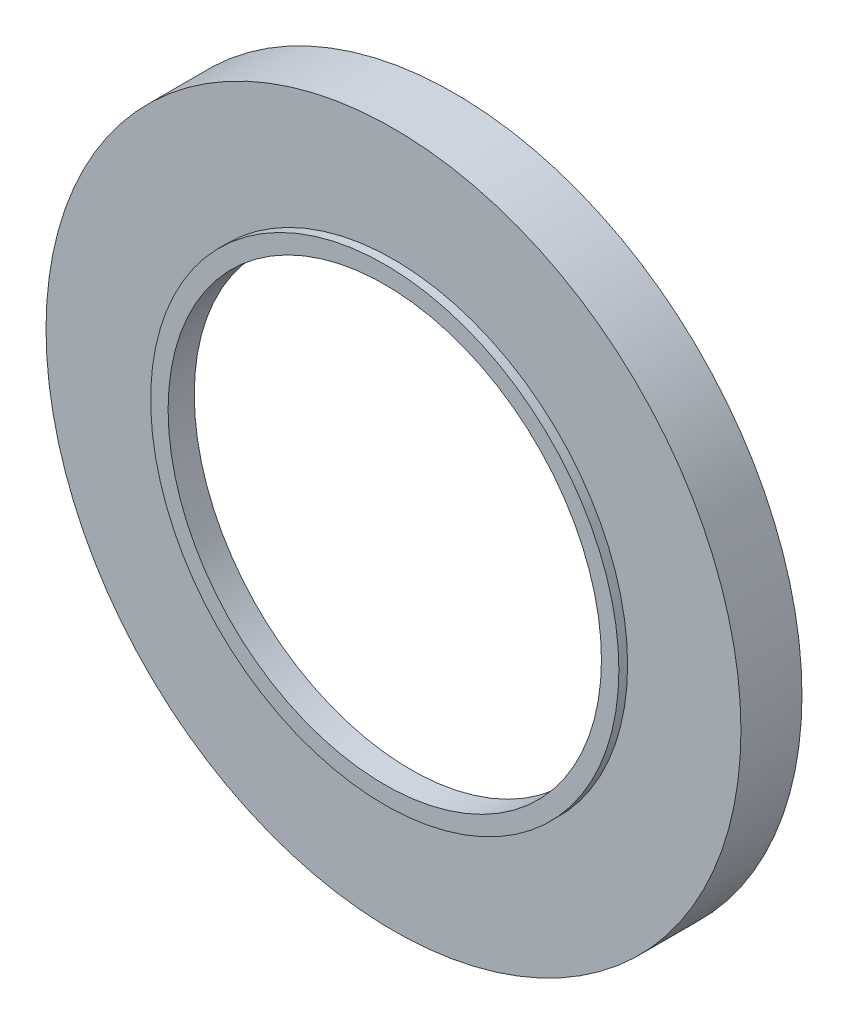
ISO-10303-21;
HEADER;
FILE_DESCRIPTION(('STEP AP214'),'2;1');
FILE_NAME('part.step','',(''),(''),'','','');
FILE_SCHEMA(('AUTOMOTIVE_DESIGN { 1 0 10303 214 1 1 1 1 }'));
ENDSEC;
DATA;
#1=APPLICATION_CONTEXT('core data for automotive mechanical design processes');
#2=APPLICATION_PROTOCOL_DEFINITION('international standard','automotive_design',2000,#1);
#3=PRODUCT_CONTEXT('',#1,'mechanical');
#4=PRODUCT('Part','Part','',(#3));
#5=PRODUCT_RELATED_PRODUCT_CATEGORY('part','',(#4));
#6=PRODUCT_DEFINITION_FORMATION('','',#4);
#7=PRODUCT_DEFINITION_CONTEXT('part definition',#1,'design');
#8=PRODUCT_DEFINITION('design','',#6,#7);
#9=PRODUCT_DEFINITION_SHAPE('','',#8);
#10=(LENGTH_UNIT() NAMED_UNIT(*) SI_UNIT(.MILLI.,.METRE.));
#11=(NAMED_UNIT(*) PLANE_ANGLE_UNIT() SI_UNIT($,.RADIAN.));
#12=(NAMED_UNIT(*) SI_UNIT($,.STERADIAN.) SOLID_ANGLE_UNIT());
#13=UNCERTAINTY_MEASURE_WITH_UNIT(LENGTH_MEASURE(1.E-05),#10,'distance_accuracy_value','');
#14=(GEOMETRIC_REPRESENTATION_CONTEXT(3) GLOBAL_UNCERTAINTY_ASSIGNED_CONTEXT((#13)) GLOBAL_UNIT_ASSIGNED_CONTEXT((#10,
#11,#12)) REPRESENTATION_CONTEXT('',''));
#15=CARTESIAN_POINT('',(0.,0.,0.));
#16=DIRECTION('',(0.,0.,1.));
#17=DIRECTION('',(1.,0.,0.));
#18=AXIS2_PLACEMENT_3D('',#15,#16,#17);
#19=CARTESIAN_POINT('',(0.,0.,7.));
#20=DIRECTION('',(0.,0.,1.));
#21=DIRECTION('',(1.,0.,0.));
#22=AXIS2_PLACEMENT_3D('',#19,#20,#21);
#23=PLANE('',#22);
#24=CARTESIAN_POINT('',(0.,0.,7.));
#25=DIRECTION('',(0.,0.,1.));
#26=DIRECTION('',(1.,0.,0.));
#27=AXIS2_PLACEMENT_3D('',#24,#25,#26);
#28=CIRCLE('',#27,39.8513353763524);
#29=CARTESIAN_POINT('',(39.8513353763524,0.,7.));
#30=VERTEX_POINT('',#29);
#31=EDGE_CURVE('E73',#30,#30,#28,.T.);
#32=ORIENTED_EDGE('',*,*,#31,.T.);
#33=EDGE_LOOP('',(#32));
#34=FACE_BOUND('',#33,.T.);
#35=CARTESIAN_POINT('',(0.,0.,7.));
#36=DIRECTION('',(0.,0.,1.));
#37=DIRECTION('',(1.,0.,0.));
#38=AXIS2_PLACEMENT_3D('',#35,#36,#37);
#39=CIRCLE('',#38,26.8513353763524);
#40=CARTESIAN_POINT('',(26.8513353763524,0.,7.));
#41=VERTEX_POINT('',#40);
#42=EDGE_CURVE('E82',#41,#41,#39,.T.);
#43=ORIENTED_EDGE('',*,*,#42,.F.);
#44=EDGE_LOOP('',(#43));
#45=FACE_BOUND('',#44,.T.);
#46=ADVANCED_FACE('F58',(#34,#45),#23,.T.);
#47=CARTESIAN_POINT('',(0.,0.,0.));
#48=DIRECTION('',(0.,0.,1.));
#49=DIRECTION('',(1.,0.,0.));
#50=AXIS2_PLACEMENT_3D('',#47,#48,#49);
#51=PLANE('',#50);
#52=CARTESIAN_POINT('',(0.,0.,0.));
#53=DIRECTION('',(0.,0.,1.));
#54=DIRECTION('',(1.,0.,0.));
#55=AXIS2_PLACEMENT_3D('',#52,#53,#54);
#56=CIRCLE('',#55,39.8513353763524);
#57=CARTESIAN_POINT('',(39.8513353763524,0.,0.));
#58=VERTEX_POINT('',#57);
#59=EDGE_CURVE('E11',#58,#58,#56,.T.);
#60=ORIENTED_EDGE('',*,*,#59,.F.);
#61=EDGE_LOOP('',(#60));
#62=FACE_BOUND('',#61,.T.);
#63=CARTESIAN_POINT('',(0.,0.,0.));
#64=DIRECTION('',(0.,0.,1.));
#65=DIRECTION('',(1.,0.,0.));
#66=AXIS2_PLACEMENT_3D('',#63,#64,#65);
#67=CIRCLE('',#66,37.8513353763524);
#68=CARTESIAN_POINT('',(37.8513353763524,0.,0.));
#69=VERTEX_POINT('',#68);
#70=EDGE_CURVE('E65',#69,#69,#67,.T.);
#71=ORIENTED_EDGE('',*,*,#70,.T.);
#72=EDGE_LOOP('',(#71));
#73=FACE_BOUND('',#72,.T.);
#74=ADVANCED_FACE('F108',(#62,#73),#51,.F.);
#75=CARTESIAN_POINT('',(0.,0.,5.));
#76=DIRECTION('',(0.,0.,-1.));
#77=DIRECTION('',(-1.,0.,0.));
#78=AXIS2_PLACEMENT_3D('',#75,#76,#77);
#79=CYLINDRICAL_SURFACE('',#78,39.8513353763524);
#80=ORIENTED_EDGE('',*,*,#59,.T.);
#81=EDGE_LOOP('',(#80));
#82=FACE_BOUND('',#81,.T.);
#83=ORIENTED_EDGE('',*,*,#31,.F.);
#84=EDGE_LOOP('',(#83));
#85=FACE_BOUND('',#84,.T.);
#86=ADVANCED_FACE('F60',(#82,#85),#79,.T.);
#87=CARTESIAN_POINT('',(0.,0.,5.));
#88=DIRECTION('',(0.,0.,-1.));
#89=DIRECTION('',(-1.,0.,0.));
#90=AXIS2_PLACEMENT_3D('',#87,#88,#89);
#91=CYLINDRICAL_SURFACE('',#90,37.8513353763524);
#92=CARTESIAN_POINT('',(0.,0.,5.));
#93=DIRECTION('',(0.,0.,1.));
#94=DIRECTION('',(1.,0.,0.));
#95=AXIS2_PLACEMENT_3D('',#92,#93,#94);
#96=CIRCLE('',#95,37.8513353763524);
#97=CARTESIAN_POINT('',(37.8513353763524,0.,5.));
#98=VERTEX_POINT('',#97);
#99=EDGE_CURVE('E69',#98,#98,#96,.T.);
#100=ORIENTED_EDGE('',*,*,#99,.T.);
#101=EDGE_LOOP('',(#100));
#102=FACE_BOUND('',#101,.T.);
#103=ORIENTED_EDGE('',*,*,#70,.F.);
#104=EDGE_LOOP('',(#103));
#105=FACE_BOUND('',#104,.T.);
#106=ADVANCED_FACE('F119',(#102,#105),#91,.F.);
#107=CARTESIAN_POINT('',(0.,0.,5.));
#108=DIRECTION('',(0.,0.,1.));
#109=DIRECTION('',(1.,0.,0.));
#110=AXIS2_PLACEMENT_3D('',#107,#108,#109);
#111=PLANE('',#110);
#112=CARTESIAN_POINT('',(0.,0.,5.));
#113=DIRECTION('',(0.,0.,1.));
#114=DIRECTION('',(1.,0.,0.));
#115=AXIS2_PLACEMENT_3D('',#112,#113,#114);
#116=CIRCLE('',#115,24.8513353763524);
#117=CARTESIAN_POINT('',(24.8513353763524,0.,5.));
#118=VERTEX_POINT('',#117);
#119=EDGE_CURVE('E78',#118,#118,#116,.T.);
#120=ORIENTED_EDGE('',*,*,#119,.T.);
#121=EDGE_LOOP('',(#120));
#122=FACE_BOUND('',#121,.T.);
#123=ORIENTED_EDGE('',*,*,#99,.F.);
#124=EDGE_LOOP('',(#123));
#125=FACE_BOUND('',#124,.T.);
#126=ADVANCED_FACE('F104',(#122,#125),#111,.F.);
#127=CARTESIAN_POINT('',(0.,0.,7.));
#128=DIRECTION('',(0.,0.,-1.));
#129=DIRECTION('',(-1.,0.,0.));
#130=AXIS2_PLACEMENT_3D('',#127,#128,#129);
#131=CYLINDRICAL_SURFACE('',#130,24.8513353763524);
#132=ORIENTED_EDGE('',*,*,#119,.F.);
#133=EDGE_LOOP('',(#132));
#134=FACE_BOUND('',#133,.T.);
#135=CARTESIAN_POINT('',(0.,0.,8.));
#136=DIRECTION('',(0.,0.,1.));
#137=DIRECTION('',(1.,0.,0.));
#138=AXIS2_PLACEMENT_3D('',#135,#136,#137);
#139=CIRCLE('',#138,24.8513353763524);
#140=CARTESIAN_POINT('',(24.8513353763524,0.,8.));
#141=VERTEX_POINT('',#140);
#142=EDGE_CURVE('E85',#141,#141,#139,.T.);
#143=ORIENTED_EDGE('',*,*,#142,.T.);
#144=EDGE_LOOP('',(#143));
#145=FACE_BOUND('',#144,.T.);
#146=ADVANCED_FACE('F91',(#134,#145),#131,.F.);
#147=CARTESIAN_POINT('',(0.,0.,8.));
#148=DIRECTION('',(0.,0.,1.));
#149=DIRECTION('',(1.,0.,0.));
#150=AXIS2_PLACEMENT_3D('',#147,#148,#149);
#151=PLANE('',#150);
#152=CARTESIAN_POINT('',(0.,0.,8.));
#153=DIRECTION('',(0.,0.,1.));
#154=DIRECTION('',(1.,0.,0.));
#155=AXIS2_PLACEMENT_3D('',#152,#153,#154);
#156=CIRCLE('',#155,26.8513353763524);
#157=CARTESIAN_POINT('',(26.8513353763524,0.,8.));
#158=VERTEX_POINT('',#157);
#159=EDGE_CURVE('E81',#158,#158,#156,.T.);
#160=ORIENTED_EDGE('',*,*,#159,.T.);
#161=EDGE_LOOP('',(#160));
#162=FACE_BOUND('',#161,.T.);
#163=ORIENTED_EDGE('',*,*,#142,.F.);
#164=EDGE_LOOP('',(#163));
#165=FACE_BOUND('',#164,.T.);
#166=ADVANCED_FACE('F93',(#162,#165),#151,.T.);
#167=CARTESIAN_POINT('',(0.,0.,8.));
#168=DIRECTION('',(0.,0.,-1.));
#169=DIRECTION('',(-1.,0.,0.));
#170=AXIS2_PLACEMENT_3D('',#167,#168,#169);
#171=CYLINDRICAL_SURFACE('',#170,26.8513353763524);
#172=ORIENTED_EDGE('',*,*,#159,.F.);
#173=EDGE_LOOP('',(#172));
#174=FACE_BOUND('',#173,.T.);
#175=ORIENTED_EDGE('',*,*,#42,.T.);
#176=EDGE_LOOP('',(#175));
#177=FACE_BOUND('',#176,.T.);
#178=ADVANCED_FACE('F95',(#174,#177),#171,.T.);
#179=CLOSED_SHELL('',(#46,#74,#86,#106,#126,#146,#166,#178));
#180=MANIFOLD_SOLID_BREP('B2',#179);
#181=ADVANCED_BREP_SHAPE_REPRESENTATION('',(#18,#180),#14);
#182=SHAPE_DEFINITION_REPRESENTATION(#9,#181);
ENDSEC;
END-ISO-10303-21;
